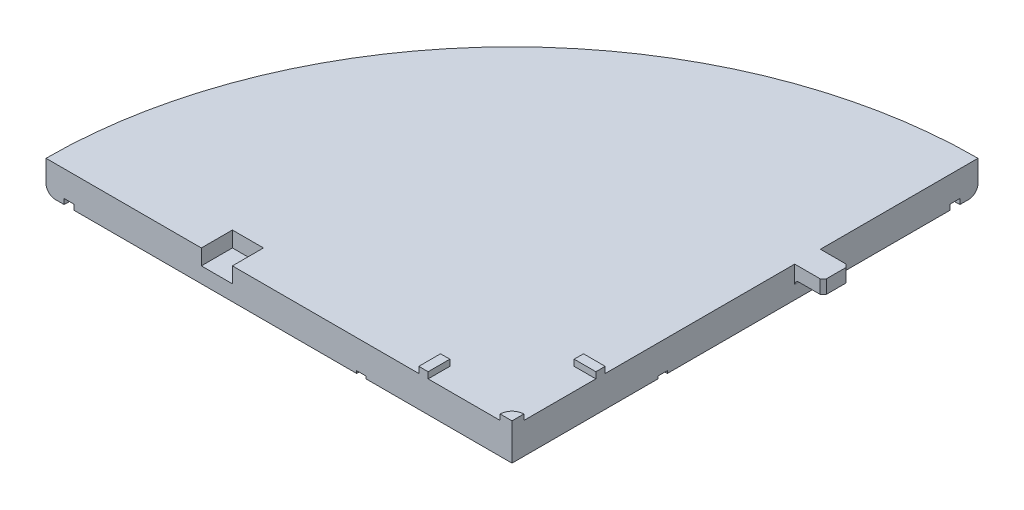
ISO-10303-21;
HEADER;
FILE_DESCRIPTION(('STEP AP214'),'2;1');
FILE_NAME('part.step','',(''),(''),'','','');
FILE_SCHEMA(('AUTOMOTIVE_DESIGN { 1 0 10303 214 1 1 1 1 }'));
ENDSEC;
DATA;
#1=APPLICATION_CONTEXT('core data for automotive mechanical design processes');
#2=APPLICATION_PROTOCOL_DEFINITION('international standard','automotive_design',2000,#1);
#3=PRODUCT_CONTEXT('',#1,'mechanical');
#4=PRODUCT('Part','Part','',(#3));
#5=PRODUCT_RELATED_PRODUCT_CATEGORY('part','',(#4));
#6=PRODUCT_DEFINITION_FORMATION('','',#4);
#7=PRODUCT_DEFINITION_CONTEXT('part definition',#1,'design');
#8=PRODUCT_DEFINITION('design','',#6,#7);
#9=PRODUCT_DEFINITION_SHAPE('','',#8);
#10=(LENGTH_UNIT() NAMED_UNIT(*) SI_UNIT(.MILLI.,.METRE.));
#11=(NAMED_UNIT(*) PLANE_ANGLE_UNIT() SI_UNIT($,.RADIAN.));
#12=(NAMED_UNIT(*) SI_UNIT($,.STERADIAN.) SOLID_ANGLE_UNIT());
#13=UNCERTAINTY_MEASURE_WITH_UNIT(LENGTH_MEASURE(1.E-05),#10,'distance_accuracy_value','');
#14=(GEOMETRIC_REPRESENTATION_CONTEXT(3) GLOBAL_UNCERTAINTY_ASSIGNED_CONTEXT((#13)) GLOBAL_UNIT_ASSIGNED_CONTEXT((#10,
#11,#12)) REPRESENTATION_CONTEXT('',''));
#15=CARTESIAN_POINT('',(0.,0.,0.));
#16=DIRECTION('',(0.,0.,1.));
#17=DIRECTION('',(1.,0.,0.));
#18=AXIS2_PLACEMENT_3D('',#15,#16,#17);
#19=CARTESIAN_POINT('',(0.,0.,0.));
#20=DIRECTION('',(0.,1.,0.));
#21=DIRECTION('',(0.,0.,1.));
#22=AXIS2_PLACEMENT_3D('',#19,#20,#21);
#23=PLANE('',#22);
#24=DIRECTION('',(0.,0.,-1.));
#25=VECTOR('',#24,1.);
#26=CARTESIAN_POINT('',(-47.,0.,0.));
#27=LINE('',#26,#25);
#28=CARTESIAN_POINT('',(-47.,0.,0.));
#29=VERTEX_POINT('',#28);
#30=CARTESIAN_POINT('',(-47.,0.,-47.));
#31=VERTEX_POINT('',#30);
#32=EDGE_CURVE('E534',#29,#31,#27,.T.);
#33=ORIENTED_EDGE('',*,*,#32,.T.);
#34=DIRECTION('',(-1.,0.,0.));
#35=VECTOR('',#34,1.);
#36=CARTESIAN_POINT('',(0.,0.,-47.));
#37=LINE('',#36,#35);
#38=CARTESIAN_POINT('',(0.,0.,-47.));
#39=VERTEX_POINT('',#38);
#40=EDGE_CURVE('E536',#39,#31,#37,.T.);
#41=ORIENTED_EDGE('',*,*,#40,.F.);
#42=DIRECTION('',(0.,0.,1.));
#43=VECTOR('',#42,1.);
#44=CARTESIAN_POINT('',(0.,0.,0.));
#45=LINE('',#44,#43);
#46=CARTESIAN_POINT('',(0.,0.,0.));
#47=VERTEX_POINT('',#46);
#48=EDGE_CURVE('E461',#39,#47,#45,.T.);
#49=ORIENTED_EDGE('',*,*,#48,.T.);
#50=DIRECTION('',(-1.,0.,0.));
#51=VECTOR('',#50,1.);
#52=CARTESIAN_POINT('',(-217.91648215282,0.,0.));
#53=LINE('',#52,#51);
#54=EDGE_CURVE('E439',#47,#29,#53,.T.);
#55=ORIENTED_EDGE('',*,*,#54,.T.);
#56=EDGE_LOOP('',(#33,#41,#49,#55));
#57=FACE_BOUND('',#56,.T.);
#58=ADVANCED_FACE('F36',(#57),#23,.F.);
#59=DIRECTION('',(-1.,0.,0.));
#60=VECTOR('',#59,1.);
#61=CARTESIAN_POINT('',(0.,0.,-50.));
#62=LINE('',#61,#60);
#63=CARTESIAN_POINT('',(0.,0.,-50.));
#64=VERTEX_POINT('',#63);
#65=CARTESIAN_POINT('',(-50.,0.,-50.));
#66=VERTEX_POINT('',#65);
#67=EDGE_CURVE('E543',#64,#66,#62,.T.);
#68=ORIENTED_EDGE('',*,*,#67,.T.);
#69=DIRECTION('',(0.,0.,-1.));
#70=VECTOR('',#69,1.);
#71=CARTESIAN_POINT('',(-50.,0.,0.));
#72=LINE('',#71,#70);
#73=CARTESIAN_POINT('',(-50.,0.,0.));
#74=VERTEX_POINT('',#73);
#75=EDGE_CURVE('E556',#74,#66,#72,.T.);
#76=ORIENTED_EDGE('',*,*,#75,.F.);
#77=CARTESIAN_POINT('',(-140.926536809106,0.,0.));
#78=VERTEX_POINT('',#77);
#79=EDGE_CURVE('E288',#74,#78,#53,.T.);
#80=ORIENTED_EDGE('',*,*,#79,.T.);
#81=CARTESIAN_POINT('',(0.,0.,0.));
#82=DIRECTION('',(0.,1.,0.));
#83=DIRECTION('',(0.,0.,-1.));
#84=AXIS2_PLACEMENT_3D('',#81,#82,#83);
#85=CIRCLE('',#84,140.926536809106);
#86=CARTESIAN_POINT('',(0.,0.,-140.926536809106));
#87=VERTEX_POINT('',#86);
#88=EDGE_CURVE('E310',#87,#78,#85,.T.);
#89=ORIENTED_EDGE('',*,*,#88,.F.);
#90=EDGE_CURVE('E465',#87,#64,#45,.T.);
#91=ORIENTED_EDGE('',*,*,#90,.T.);
#92=EDGE_LOOP('',(#68,#76,#80,#89,#91));
#93=FACE_BOUND('',#92,.T.);
#94=ADVANCED_FACE('F542',(#93),#23,.F.);
#95=CARTESIAN_POINT('',(-217.91648215282,0.,0.));
#96=DIRECTION('',(0.,0.,-1.));
#97=DIRECTION('',(-1.,0.,0.));
#98=AXIS2_PLACEMENT_3D('',#95,#96,#97);
#99=PLANE('',#98);
#100=DIRECTION('',(0.,-1.,0.));
#101=VECTOR('',#100,1.);
#102=CARTESIAN_POINT('',(-150.,10.,0.));
#103=LINE('',#102,#101);
#104=CARTESIAN_POINT('',(-150.,3.,0.));
#105=VERTEX_POINT('',#104);
#106=CARTESIAN_POINT('',(-150.,10.,0.));
#107=VERTEX_POINT('',#106);
#108=EDGE_CURVE('E456',#105,#107,#103,.F.);
#109=ORIENTED_EDGE('',*,*,#108,.F.);
#110=CARTESIAN_POINT('',(-147.,3.,0.));
#111=DIRECTION('',(0.,0.,-1.));
#112=DIRECTION('',(-1.,0.,0.));
#113=AXIS2_PLACEMENT_3D('',#110,#111,#112);
#114=CIRCLE('',#113,3.);
#115=CARTESIAN_POINT('',(-147.,0.,0.));
#116=VERTEX_POINT('',#115);
#117=EDGE_CURVE('E487',#105,#116,#114,.F.);
#118=ORIENTED_EDGE('',*,*,#117,.T.);
#119=CARTESIAN_POINT('',(-144.178447036119,0.,0.));
#120=VERTEX_POINT('',#119);
#121=EDGE_CURVE('E443',#120,#116,#53,.T.);
#122=ORIENTED_EDGE('',*,*,#121,.F.);
#123=DIRECTION('',(0.,-1.,0.));
#124=VECTOR('',#123,1.);
#125=CARTESIAN_POINT('',(-144.178447036119,1.7,0.));
#126=LINE('',#125,#124);
#127=CARTESIAN_POINT('',(-144.178447036119,1.7,0.));
#128=VERTEX_POINT('',#127);
#129=EDGE_CURVE('E322',#128,#120,#126,.T.);
#130=ORIENTED_EDGE('',*,*,#129,.F.);
#131=DIRECTION('',(-1.,0.,0.));
#132=VECTOR('',#131,1.);
#133=CARTESIAN_POINT('',(-140.926536809106,1.7,0.));
#134=LINE('',#133,#132);
#135=CARTESIAN_POINT('',(-140.926536809106,1.7,0.));
#136=VERTEX_POINT('',#135);
#137=EDGE_CURVE('E299',#136,#128,#134,.T.);
#138=ORIENTED_EDGE('',*,*,#137,.F.);
#139=DIRECTION('',(0.,-1.,0.));
#140=VECTOR('',#139,1.);
#141=CARTESIAN_POINT('',(-140.926536809106,1.7,0.));
#142=LINE('',#141,#140);
#143=EDGE_CURVE('E309',#136,#78,#142,.T.);
#144=ORIENTED_EDGE('',*,*,#143,.T.);
#145=ORIENTED_EDGE('',*,*,#79,.F.);
#146=DIRECTION('',(0.,-1.,0.));
#147=VECTOR('',#146,1.);
#148=CARTESIAN_POINT('',(-50.,0.8,0.));
#149=LINE('',#148,#147);
#150=CARTESIAN_POINT('',(-50.,0.8,0.));
#151=VERTEX_POINT('',#150);
#152=EDGE_CURVE('E268',#151,#74,#149,.T.);
#153=ORIENTED_EDGE('',*,*,#152,.F.);
#154=DIRECTION('',(-1.,0.,0.));
#155=VECTOR('',#154,1.);
#156=CARTESIAN_POINT('',(0.,0.8,0.));
#157=LINE('',#156,#155);
#158=CARTESIAN_POINT('',(-47.,0.8,0.));
#159=VERTEX_POINT('',#158);
#160=EDGE_CURVE('E274',#159,#151,#157,.T.);
#161=ORIENTED_EDGE('',*,*,#160,.F.);
#162=DIRECTION('',(0.,-1.,0.));
#163=VECTOR('',#162,1.);
#164=CARTESIAN_POINT('',(-47.,0.8,0.));
#165=LINE('',#164,#163);
#166=EDGE_CURVE('E289',#159,#29,#165,.T.);
#167=ORIENTED_EDGE('',*,*,#166,.T.);
#168=ORIENTED_EDGE('',*,*,#54,.F.);
#169=DIRECTION('',(0.,1.,0.));
#170=VECTOR('',#169,1.);
#171=CARTESIAN_POINT('',(0.,0.,0.));
#172=LINE('',#171,#170);
#173=CARTESIAN_POINT('',(0.,11.8,0.));
#174=VERTEX_POINT('',#173);
#175=EDGE_CURVE('E442',#47,#174,#172,.T.);
#176=ORIENTED_EDGE('',*,*,#175,.T.);
#177=DIRECTION('',(1.,0.,0.));
#178=VECTOR('',#177,1.);
#179=CARTESIAN_POINT('',(0.,11.8,0.));
#180=LINE('',#179,#178);
#181=CARTESIAN_POINT('',(-3.825,11.8,0.));
#182=VERTEX_POINT('',#181);
#183=EDGE_CURVE('E423',#182,#174,#180,.T.);
#184=ORIENTED_EDGE('',*,*,#183,.F.);
#185=DIRECTION('',(0.,-1.,0.));
#186=VECTOR('',#185,1.);
#187=CARTESIAN_POINT('',(-3.825,11.8,0.));
#188=LINE('',#187,#186);
#189=CARTESIAN_POINT('',(-3.825,10.,0.));
#190=VERTEX_POINT('',#189);
#191=EDGE_CURVE('E430',#182,#190,#188,.T.);
#192=ORIENTED_EDGE('',*,*,#191,.T.);
#193=DIRECTION('',(-1.,0.,0.));
#194=VECTOR('',#193,1.);
#195=CARTESIAN_POINT('',(-217.91648215282,10.,0.));
#196=LINE('',#195,#194);
#197=CARTESIAN_POINT('',(-27.,10.,0.));
#198=VERTEX_POINT('',#197);
#199=EDGE_CURVE('E444',#190,#198,#196,.T.);
#200=ORIENTED_EDGE('',*,*,#199,.T.);
#201=DIRECTION('',(0.,-1.,0.));
#202=VECTOR('',#201,1.);
#203=CARTESIAN_POINT('',(-27.,12.,0.));
#204=LINE('',#203,#202);
#205=CARTESIAN_POINT('',(-27.,12.,0.));
#206=VERTEX_POINT('',#205);
#207=EDGE_CURVE('E420',#206,#198,#204,.T.);
#208=ORIENTED_EDGE('',*,*,#207,.F.);
#209=DIRECTION('',(1.,0.,0.));
#210=VECTOR('',#209,1.);
#211=CARTESIAN_POINT('',(-27.,12.,0.));
#212=LINE('',#211,#210);
#213=CARTESIAN_POINT('',(-30.,12.,0.));
#214=VERTEX_POINT('',#213);
#215=EDGE_CURVE('E397',#214,#206,#212,.T.);
#216=ORIENTED_EDGE('',*,*,#215,.F.);
#217=DIRECTION('',(0.,-1.,0.));
#218=VECTOR('',#217,1.);
#219=CARTESIAN_POINT('',(-30.,12.,0.));
#220=LINE('',#219,#218);
#221=CARTESIAN_POINT('',(-30.0000000000001,10.,0.));
#222=VERTEX_POINT('',#221);
#223=EDGE_CURVE('E407',#214,#222,#220,.T.);
#224=ORIENTED_EDGE('',*,*,#223,.T.);
#225=CARTESIAN_POINT('',(-90.0000000000001,10.,0.));
#226=VERTEX_POINT('',#225);
#227=EDGE_CURVE('E448',#222,#226,#196,.T.);
#228=ORIENTED_EDGE('',*,*,#227,.T.);
#229=DIRECTION('',(0.,1.,0.));
#230=VECTOR('',#229,1.);
#231=CARTESIAN_POINT('',(-90.0000000000001,5.,0.));
#232=LINE('',#231,#230);
#233=CARTESIAN_POINT('',(-90.0000000000001,5.,0.));
#234=VERTEX_POINT('',#233);
#235=EDGE_CURVE('E364',#234,#226,#232,.T.);
#236=ORIENTED_EDGE('',*,*,#235,.F.);
#237=DIRECTION('',(1.,0.,0.));
#238=VECTOR('',#237,1.);
#239=CARTESIAN_POINT('',(0.,5.,0.));
#240=LINE('',#239,#238);
#241=CARTESIAN_POINT('',(-100.,5.,0.));
#242=VERTEX_POINT('',#241);
#243=EDGE_CURVE('E349',#242,#234,#240,.T.);
#244=ORIENTED_EDGE('',*,*,#243,.F.);
#245=DIRECTION('',(0.,1.,0.));
#246=VECTOR('',#245,1.);
#247=CARTESIAN_POINT('',(-100.,5.,0.));
#248=LINE('',#247,#246);
#249=CARTESIAN_POINT('',(-100.,10.,0.));
#250=VERTEX_POINT('',#249);
#251=EDGE_CURVE('E366',#242,#250,#248,.T.);
#252=ORIENTED_EDGE('',*,*,#251,.T.);
#253=EDGE_CURVE('E438',#250,#107,#196,.T.);
#254=ORIENTED_EDGE('',*,*,#253,.T.);
#255=EDGE_LOOP('',(#109,#118,#122,#130,#138,#144,#145,#153,#161,#167,#168,#176,#184,#192,#200,
#208,#216,#224,#228,#236,#244,#252,#254));
#256=FACE_BOUND('',#255,.T.);
#257=ADVANCED_FACE('F286',(#256),#99,.F.);
#258=CARTESIAN_POINT('',(0.,0.,0.));
#259=DIRECTION('',(-1.,0.,0.));
#260=DIRECTION('',(0.,0.,1.));
#261=AXIS2_PLACEMENT_3D('',#258,#259,#260);
#262=PLANE('',#261);
#263=DIRECTION('',(0.,1.,0.));
#264=VECTOR('',#263,1.);
#265=CARTESIAN_POINT('',(0.,5.65,-99.2773150453995));
#266=LINE('',#265,#264);
#267=CARTESIAN_POINT('',(0.,4.25,-99.2773150453995));
#268=VERTEX_POINT('',#267);
#269=CARTESIAN_POINT('',(0.,10.,-99.2773150453995));
#270=VERTEX_POINT('',#269);
#271=EDGE_CURVE('E51',#268,#270,#266,.T.);
#272=ORIENTED_EDGE('',*,*,#271,.F.);
#273=DIRECTION('',(0.,0.,-1.));
#274=VECTOR('',#273,1.);
#275=CARTESIAN_POINT('',(0.,4.25,-91.));
#276=LINE('',#275,#274);
#277=CARTESIAN_POINT('',(0.,4.25,-91.));
#278=VERTEX_POINT('',#277);
#279=EDGE_CURVE('E496',#268,#278,#276,.F.);
#280=ORIENTED_EDGE('',*,*,#279,.T.);
#281=DIRECTION('',(0.,1.,0.));
#282=VECTOR('',#281,1.);
#283=CARTESIAN_POINT('',(0.,5.65,-91.));
#284=LINE('',#283,#282);
#285=CARTESIAN_POINT('',(0.,10.,-91.));
#286=VERTEX_POINT('',#285);
#287=EDGE_CURVE('E58',#278,#286,#284,.T.);
#288=ORIENTED_EDGE('',*,*,#287,.T.);
#289=DIRECTION('',(0.,0.,1.));
#290=VECTOR('',#289,1.);
#291=CARTESIAN_POINT('',(0.,10.,0.));
#292=LINE('',#291,#290);
#293=CARTESIAN_POINT('',(0.,10.,-30.));
#294=VERTEX_POINT('',#293);
#295=EDGE_CURVE('E451',#286,#294,#292,.T.);
#296=ORIENTED_EDGE('',*,*,#295,.T.);
#297=DIRECTION('',(0.,-1.,0.));
#298=VECTOR('',#297,1.);
#299=CARTESIAN_POINT('',(0.,12.,-30.));
#300=LINE('',#299,#298);
#301=CARTESIAN_POINT('',(0.,12.,-30.));
#302=VERTEX_POINT('',#301);
#303=EDGE_CURVE('E393',#302,#294,#300,.T.);
#304=ORIENTED_EDGE('',*,*,#303,.F.);
#305=DIRECTION('',(0.,0.,-1.));
#306=VECTOR('',#305,1.);
#307=CARTESIAN_POINT('',(0.,12.,-30.));
#308=LINE('',#307,#306);
#309=CARTESIAN_POINT('',(0.,12.,-27.));
#310=VERTEX_POINT('',#309);
#311=EDGE_CURVE('E370',#310,#302,#308,.T.);
#312=ORIENTED_EDGE('',*,*,#311,.F.);
#313=DIRECTION('',(0.,-1.,0.));
#314=VECTOR('',#313,1.);
#315=CARTESIAN_POINT('',(0.,12.,-27.));
#316=LINE('',#315,#314);
#317=CARTESIAN_POINT('',(0.,10.,-27.));
#318=VERTEX_POINT('',#317);
#319=EDGE_CURVE('E380',#310,#318,#316,.T.);
#320=ORIENTED_EDGE('',*,*,#319,.T.);
#321=CARTESIAN_POINT('',(0.,10.,-3.825));
#322=VERTEX_POINT('',#321);
#323=EDGE_CURVE('E447',#318,#322,#292,.T.);
#324=ORIENTED_EDGE('',*,*,#323,.T.);
#325=DIRECTION('',(0.,-1.,0.));
#326=VECTOR('',#325,1.);
#327=CARTESIAN_POINT('',(0.,11.8,-3.825));
#328=LINE('',#327,#326);
#329=CARTESIAN_POINT('',(0.,11.8,-3.825));
#330=VERTEX_POINT('',#329);
#331=EDGE_CURVE('E435',#330,#322,#328,.T.);
#332=ORIENTED_EDGE('',*,*,#331,.F.);
#333=DIRECTION('',(0.,0.,-1.));
#334=VECTOR('',#333,1.);
#335=CARTESIAN_POINT('',(0.,11.8,-3.825));
#336=LINE('',#335,#334);
#337=EDGE_CURVE('E426',#174,#330,#336,.T.);
#338=ORIENTED_EDGE('',*,*,#337,.F.);
#339=ORIENTED_EDGE('',*,*,#175,.F.);
#340=ORIENTED_EDGE('',*,*,#48,.F.);
#341=DIRECTION('',(0.,-1.,0.));
#342=VECTOR('',#341,1.);
#343=CARTESIAN_POINT('',(0.,0.8,-47.));
#344=LINE('',#343,#342);
#345=CARTESIAN_POINT('',(0.,0.8,-47.));
#346=VERTEX_POINT('',#345);
#347=EDGE_CURVE('E550',#346,#39,#344,.T.);
#348=ORIENTED_EDGE('',*,*,#347,.F.);
#349=DIRECTION('',(0.,0.,1.));
#350=VECTOR('',#349,1.);
#351=CARTESIAN_POINT('',(0.,0.8,0.));
#352=LINE('',#351,#350);
#353=CARTESIAN_POINT('',(0.,0.8,-50.));
#354=VERTEX_POINT('',#353);
#355=EDGE_CURVE('E548',#354,#346,#352,.T.);
#356=ORIENTED_EDGE('',*,*,#355,.F.);
#357=DIRECTION('',(0.,-1.,0.));
#358=VECTOR('',#357,1.);
#359=CARTESIAN_POINT('',(0.,0.8,-50.));
#360=LINE('',#359,#358);
#361=EDGE_CURVE('E291',#354,#64,#360,.T.);
#362=ORIENTED_EDGE('',*,*,#361,.T.);
#363=ORIENTED_EDGE('',*,*,#90,.F.);
#364=DIRECTION('',(0.,-1.,0.));
#365=VECTOR('',#364,1.);
#366=CARTESIAN_POINT('',(0.,1.7,-140.926536809106));
#367=LINE('',#366,#365);
#368=CARTESIAN_POINT('',(0.,1.7,-140.926536809106));
#369=VERTEX_POINT('',#368);
#370=EDGE_CURVE('E316',#369,#87,#367,.T.);
#371=ORIENTED_EDGE('',*,*,#370,.F.);
#372=DIRECTION('',(0.,0.,1.));
#373=VECTOR('',#372,1.);
#374=CARTESIAN_POINT('',(0.,1.7,-140.926536809106));
#375=LINE('',#374,#373);
#376=CARTESIAN_POINT('',(0.,1.7,-144.178447036119));
#377=VERTEX_POINT('',#376);
#378=EDGE_CURVE('E306',#377,#369,#375,.T.);
#379=ORIENTED_EDGE('',*,*,#378,.F.);
#380=DIRECTION('',(0.,-1.,0.));
#381=VECTOR('',#380,1.);
#382=CARTESIAN_POINT('',(0.,1.7,-144.178447036119));
#383=LINE('',#382,#381);
#384=CARTESIAN_POINT('',(0.,0.,-144.178447036119));
#385=VERTEX_POINT('',#384);
#386=EDGE_CURVE('E319',#377,#385,#383,.T.);
#387=ORIENTED_EDGE('',*,*,#386,.T.);
#388=CARTESIAN_POINT('',(0.,0.,-147.));
#389=VERTEX_POINT('',#388);
#390=EDGE_CURVE('E462',#389,#385,#45,.T.);
#391=ORIENTED_EDGE('',*,*,#390,.F.);
#392=CARTESIAN_POINT('',(0.,3.,-147.));
#393=DIRECTION('',(-1.,0.,0.));
#394=DIRECTION('',(0.,0.,1.));
#395=AXIS2_PLACEMENT_3D('',#392,#393,#394);
#396=CIRCLE('',#395,3.);
#397=CARTESIAN_POINT('',(0.,3.,-150.));
#398=VERTEX_POINT('',#397);
#399=EDGE_CURVE('E491',#389,#398,#396,.F.);
#400=ORIENTED_EDGE('',*,*,#399,.T.);
#401=DIRECTION('',(0.,-1.,0.));
#402=VECTOR('',#401,1.);
#403=CARTESIAN_POINT('',(0.,10.,-150.));
#404=LINE('',#403,#402);
#405=CARTESIAN_POINT('',(0.,10.,-150.));
#406=VERTEX_POINT('',#405);
#407=EDGE_CURVE('E453',#406,#398,#404,.T.);
#408=ORIENTED_EDGE('',*,*,#407,.F.);
#409=EDGE_CURVE('E449',#406,#270,#292,.T.);
#410=ORIENTED_EDGE('',*,*,#409,.T.);
#411=EDGE_LOOP('',(#272,#280,#288,#296,#304,#312,#320,#324,#332,#338,#339,#340,#348,#356,#362,
#363,#371,#379,#387,#391,#400,#408,#410));
#412=FACE_BOUND('',#411,.T.);
#413=ADVANCED_FACE('F505',(#412),#262,.F.);
#414=CARTESIAN_POINT('',(0.,10.,0.));
#415=DIRECTION('',(0.,1.,0.));
#416=DIRECTION('',(0.,0.,1.));
#417=AXIS2_PLACEMENT_3D('',#414,#415,#416);
#418=PLANE('',#417);
#419=DIRECTION('',(1.,0.,0.));
#420=VECTOR('',#419,1.);
#421=CARTESIAN_POINT('',(0.,10.,-91.));
#422=LINE('',#421,#420);
#423=CARTESIAN_POINT('',(8.19375165728234,10.,-91.));
#424=VERTEX_POINT('',#423);
#425=EDGE_CURVE('E329',#286,#424,#422,.T.);
#426=ORIENTED_EDGE('',*,*,#425,.T.);
#427=DIRECTION('',(-0.707106781186538,0.,0.707106781186557));
#428=VECTOR('',#427,1.);
#429=CARTESIAN_POINT('',(-41.4031241713587,10.,-41.4031241713576));
#430=LINE('',#429,#428);
#431=CARTESIAN_POINT('',(9.19375165728231,10.,-92.));
#432=VERTEX_POINT('',#431);
#433=EDGE_CURVE('E470',#424,#432,#430,.F.);
#434=ORIENTED_EDGE('',*,*,#433,.T.);
#435=DIRECTION('',(0.,0.,-1.));
#436=VECTOR('',#435,1.);
#437=CARTESIAN_POINT('',(9.19375165728231,10.,0.));
#438=LINE('',#437,#436);
#439=CARTESIAN_POINT('',(9.19375165728231,10.,-98.2773150453994));
#440=VERTEX_POINT('',#439);
#441=EDGE_CURVE('E318',#432,#440,#438,.T.);
#442=ORIENTED_EDGE('',*,*,#441,.T.);
#443=DIRECTION('',(0.707106781186538,0.,0.707106781186557));
#444=VECTOR('',#443,1.);
#445=CARTESIAN_POINT('',(53.735533351341,10.,-53.7355333513395));
#446=LINE('',#445,#444);
#447=CARTESIAN_POINT('',(8.19375165728228,10.,-99.2773150453995));
#448=VERTEX_POINT('',#447);
#449=EDGE_CURVE('E468',#440,#448,#446,.F.);
#450=ORIENTED_EDGE('',*,*,#449,.T.);
#451=DIRECTION('',(-1.,0.,0.));
#452=VECTOR('',#451,1.);
#453=CARTESIAN_POINT('',(0.,10.,-99.2773150453995));
#454=LINE('',#453,#452);
#455=EDGE_CURVE('E336',#448,#270,#454,.T.);
#456=ORIENTED_EDGE('',*,*,#455,.T.);
#457=ORIENTED_EDGE('',*,*,#409,.F.);
#458=CARTESIAN_POINT('',(0.,10.,0.));
#459=DIRECTION('',(0.,1.,0.));
#460=DIRECTION('',(0.,0.,1.));
#461=AXIS2_PLACEMENT_3D('',#458,#459,#460);
#462=CIRCLE('',#461,150.);
#463=EDGE_CURVE('E458',#406,#107,#462,.T.);
#464=ORIENTED_EDGE('',*,*,#463,.T.);
#465=ORIENTED_EDGE('',*,*,#253,.F.);
#466=DIRECTION('',(0.,0.,1.));
#467=VECTOR('',#466,1.);
#468=CARTESIAN_POINT('',(-100.,10.,0.));
#469=LINE('',#468,#467);
#470=CARTESIAN_POINT('',(-100.,10.,-9.99999999999999));
#471=VERTEX_POINT('',#470);
#472=EDGE_CURVE('E357',#471,#250,#469,.T.);
#473=ORIENTED_EDGE('',*,*,#472,.F.);
#474=DIRECTION('',(-1.,0.,0.));
#475=VECTOR('',#474,1.);
#476=CARTESIAN_POINT('',(0.,10.,-10.));
#477=LINE('',#476,#475);
#478=CARTESIAN_POINT('',(-90.0000000000001,10.,-9.99999999999999));
#479=VERTEX_POINT('',#478);
#480=EDGE_CURVE('E341',#479,#471,#477,.T.);
#481=ORIENTED_EDGE('',*,*,#480,.F.);
#482=DIRECTION('',(0.,0.,-1.));
#483=VECTOR('',#482,1.);
#484=CARTESIAN_POINT('',(-90.0000000000001,10.,0.));
#485=LINE('',#484,#483);
#486=EDGE_CURVE('E347',#226,#479,#485,.T.);
#487=ORIENTED_EDGE('',*,*,#486,.F.);
#488=ORIENTED_EDGE('',*,*,#227,.F.);
#489=DIRECTION('',(0.,0.,1.));
#490=VECTOR('',#489,1.);
#491=CARTESIAN_POINT('',(-30.,10.,-7.));
#492=LINE('',#491,#490);
#493=CARTESIAN_POINT('',(-30.,10.,-7.));
#494=VERTEX_POINT('',#493);
#495=EDGE_CURVE('E401',#494,#222,#492,.T.);
#496=ORIENTED_EDGE('',*,*,#495,.F.);
#497=DIRECTION('',(-1.,0.,0.));
#498=VECTOR('',#497,1.);
#499=CARTESIAN_POINT('',(-27.,10.,-7.));
#500=LINE('',#499,#498);
#501=CARTESIAN_POINT('',(-27.,10.,-7.));
#502=VERTEX_POINT('',#501);
#503=EDGE_CURVE('E409',#502,#494,#500,.T.);
#504=ORIENTED_EDGE('',*,*,#503,.F.);
#505=DIRECTION('',(0.,0.,-1.));
#506=VECTOR('',#505,1.);
#507=CARTESIAN_POINT('',(-27.,10.,0.));
#508=LINE('',#507,#506);
#509=EDGE_CURVE('E396',#198,#502,#508,.T.);
#510=ORIENTED_EDGE('',*,*,#509,.F.);
#511=ORIENTED_EDGE('',*,*,#199,.F.);
#512=CARTESIAN_POINT('',(0.,10.,0.));
#513=DIRECTION('',(0.,1.,0.));
#514=DIRECTION('',(0.,0.,1.));
#515=AXIS2_PLACEMENT_3D('',#512,#513,#514);
#516=CIRCLE('',#515,3.825);
#517=EDGE_CURVE('E422',#322,#190,#516,.T.);
#518=ORIENTED_EDGE('',*,*,#517,.F.);
#519=ORIENTED_EDGE('',*,*,#323,.F.);
#520=DIRECTION('',(1.,0.,0.));
#521=VECTOR('',#520,1.);
#522=CARTESIAN_POINT('',(0.,10.,-27.));
#523=LINE('',#522,#521);
#524=CARTESIAN_POINT('',(-7.,10.,-27.));
#525=VERTEX_POINT('',#524);
#526=EDGE_CURVE('E374',#525,#318,#523,.T.);
#527=ORIENTED_EDGE('',*,*,#526,.F.);
#528=DIRECTION('',(0.,0.,1.));
#529=VECTOR('',#528,1.);
#530=CARTESIAN_POINT('',(-7.,10.,-27.));
#531=LINE('',#530,#529);
#532=CARTESIAN_POINT('',(-7.,10.,-30.));
#533=VERTEX_POINT('',#532);
#534=EDGE_CURVE('E382',#533,#525,#531,.T.);
#535=ORIENTED_EDGE('',*,*,#534,.F.);
#536=DIRECTION('',(-1.,0.,0.));
#537=VECTOR('',#536,1.);
#538=CARTESIAN_POINT('',(-7.,10.,-30.));
#539=LINE('',#538,#537);
#540=EDGE_CURVE('E363',#294,#533,#539,.T.);
#541=ORIENTED_EDGE('',*,*,#540,.F.);
#542=ORIENTED_EDGE('',*,*,#295,.F.);
#543=EDGE_LOOP('',(#426,#434,#442,#450,#456,#457,#464,#465,#473,#481,#487,#488,#496,#504,#510,
#511,#518,#519,#527,#535,#541,#542));
#544=FACE_BOUND('',#543,.T.);
#545=ADVANCED_FACE('F510',(#544),#418,.T.);
#546=CARTESIAN_POINT('',(0.,10.,0.));
#547=DIRECTION('',(0.,-1.,0.));
#548=DIRECTION('',(0.,0.,-1.));
#549=AXIS2_PLACEMENT_3D('',#546,#547,#548);
#550=CYLINDRICAL_SURFACE('',#549,150.);
#551=ORIENTED_EDGE('',*,*,#407,.T.);
#552=CARTESIAN_POINT('',(0.,3.,0.));
#553=DIRECTION('',(0.,1.,0.));
#554=DIRECTION('',(0.,0.,1.));
#555=AXIS2_PLACEMENT_3D('',#552,#553,#554);
#556=CIRCLE('',#555,150.);
#557=EDGE_CURVE('E484',#398,#105,#556,.T.);
#558=ORIENTED_EDGE('',*,*,#557,.T.);
#559=ORIENTED_EDGE('',*,*,#108,.T.);
#560=ORIENTED_EDGE('',*,*,#463,.F.);
#561=EDGE_LOOP('',(#551,#558,#559,#560));
#562=FACE_BOUND('',#561,.T.);
#563=ADVANCED_FACE('F591',(#562),#550,.T.);
#564=ORIENTED_EDGE('',*,*,#121,.T.);
#565=CARTESIAN_POINT('',(0.,0.,0.));
#566=DIRECTION('',(0.,1.,0.));
#567=DIRECTION('',(0.,0.,1.));
#568=AXIS2_PLACEMENT_3D('',#565,#566,#567);
#569=CIRCLE('',#568,147.);
#570=EDGE_CURVE('E489',#116,#389,#569,.F.);
#571=ORIENTED_EDGE('',*,*,#570,.T.);
#572=ORIENTED_EDGE('',*,*,#390,.T.);
#573=CARTESIAN_POINT('',(0.,0.,0.));
#574=DIRECTION('',(0.,-1.,0.));
#575=DIRECTION('',(0.,0.,-1.));
#576=AXIS2_PLACEMENT_3D('',#573,#574,#575);
#577=CIRCLE('',#576,144.178447036119);
#578=EDGE_CURVE('E300',#120,#385,#577,.T.);
#579=ORIENTED_EDGE('',*,*,#578,.F.);
#580=EDGE_LOOP('',(#564,#571,#572,#579));
#581=FACE_BOUND('',#580,.T.);
#582=ADVANCED_FACE('F584',(#581),#23,.F.);
#583=CARTESIAN_POINT('',(0.,11.8,0.));
#584=DIRECTION('',(0.,-1.,0.));
#585=DIRECTION('',(0.,0.,-1.));
#586=AXIS2_PLACEMENT_3D('',#583,#584,#585);
#587=CYLINDRICAL_SURFACE('',#586,3.825);
#588=ORIENTED_EDGE('',*,*,#517,.T.);
#589=ORIENTED_EDGE('',*,*,#191,.F.);
#590=CARTESIAN_POINT('',(0.,11.8,0.));
#591=DIRECTION('',(0.,1.,0.));
#592=DIRECTION('',(0.,0.,1.));
#593=AXIS2_PLACEMENT_3D('',#590,#591,#592);
#594=CIRCLE('',#593,3.825);
#595=EDGE_CURVE('E428',#330,#182,#594,.T.);
#596=ORIENTED_EDGE('',*,*,#595,.F.);
#597=ORIENTED_EDGE('',*,*,#331,.T.);
#598=EDGE_LOOP('',(#588,#589,#596,#597));
#599=FACE_BOUND('',#598,.T.);
#600=ADVANCED_FACE('F523',(#599),#587,.T.);
#601=CARTESIAN_POINT('',(0.,11.8,0.));
#602=DIRECTION('',(0.,1.,0.));
#603=DIRECTION('',(0.,0.,1.));
#604=AXIS2_PLACEMENT_3D('',#601,#602,#603);
#605=PLANE('',#604);
#606=ORIENTED_EDGE('',*,*,#183,.T.);
#607=ORIENTED_EDGE('',*,*,#337,.T.);
#608=ORIENTED_EDGE('',*,*,#595,.T.);
#609=EDGE_LOOP('',(#606,#607,#608));
#610=FACE_BOUND('',#609,.T.);
#611=ADVANCED_FACE('F526',(#610),#605,.T.);
#612=CARTESIAN_POINT('',(-27.,12.,0.));
#613=DIRECTION('',(-1.,0.,0.));
#614=DIRECTION('',(0.,0.,1.));
#615=AXIS2_PLACEMENT_3D('',#612,#613,#614);
#616=PLANE('',#615);
#617=ORIENTED_EDGE('',*,*,#509,.T.);
#618=DIRECTION('',(0.,-1.,0.));
#619=VECTOR('',#618,1.);
#620=CARTESIAN_POINT('',(-27.,12.,-7.));
#621=LINE('',#620,#619);
#622=CARTESIAN_POINT('',(-27.,12.,-7.));
#623=VERTEX_POINT('',#622);
#624=EDGE_CURVE('E417',#623,#502,#621,.T.);
#625=ORIENTED_EDGE('',*,*,#624,.F.);
#626=DIRECTION('',(0.,0.,-1.));
#627=VECTOR('',#626,1.);
#628=CARTESIAN_POINT('',(-27.,12.,0.));
#629=LINE('',#628,#627);
#630=EDGE_CURVE('E400',#206,#623,#629,.T.);
#631=ORIENTED_EDGE('',*,*,#630,.F.);
#632=ORIENTED_EDGE('',*,*,#207,.T.);
#633=EDGE_LOOP('',(#617,#625,#631,#632));
#634=FACE_BOUND('',#633,.T.);
#635=ADVANCED_FACE('F900',(#634),#616,.F.);
#636=CARTESIAN_POINT('',(-27.,12.,-7.));
#637=DIRECTION('',(0.,0.,1.));
#638=DIRECTION('',(1.,0.,0.));
#639=AXIS2_PLACEMENT_3D('',#636,#637,#638);
#640=PLANE('',#639);
#641=ORIENTED_EDGE('',*,*,#503,.T.);
#642=DIRECTION('',(0.,-1.,0.));
#643=VECTOR('',#642,1.);
#644=CARTESIAN_POINT('',(-30.,12.,-7.));
#645=LINE('',#644,#643);
#646=CARTESIAN_POINT('',(-30.,12.,-7.));
#647=VERTEX_POINT('',#646);
#648=EDGE_CURVE('E414',#647,#494,#645,.T.);
#649=ORIENTED_EDGE('',*,*,#648,.F.);
#650=DIRECTION('',(-1.,0.,0.));
#651=VECTOR('',#650,1.);
#652=CARTESIAN_POINT('',(-27.,12.,-7.));
#653=LINE('',#652,#651);
#654=EDGE_CURVE('E403',#623,#647,#653,.T.);
#655=ORIENTED_EDGE('',*,*,#654,.F.);
#656=ORIENTED_EDGE('',*,*,#624,.T.);
#657=EDGE_LOOP('',(#641,#649,#655,#656));
#658=FACE_BOUND('',#657,.T.);
#659=ADVANCED_FACE('F890',(#658),#640,.F.);
#660=CARTESIAN_POINT('',(-30.,12.,-7.));
#661=DIRECTION('',(1.,0.,0.));
#662=DIRECTION('',(0.,0.,-1.));
#663=AXIS2_PLACEMENT_3D('',#660,#661,#662);
#664=PLANE('',#663);
#665=ORIENTED_EDGE('',*,*,#495,.T.);
#666=ORIENTED_EDGE('',*,*,#223,.F.);
#667=DIRECTION('',(0.,0.,1.));
#668=VECTOR('',#667,1.);
#669=CARTESIAN_POINT('',(-30.,12.,-7.));
#670=LINE('',#669,#668);
#671=EDGE_CURVE('E405',#647,#214,#670,.T.);
#672=ORIENTED_EDGE('',*,*,#671,.F.);
#673=ORIENTED_EDGE('',*,*,#648,.T.);
#674=EDGE_LOOP('',(#665,#666,#672,#673));
#675=FACE_BOUND('',#674,.T.);
#676=ADVANCED_FACE('F880',(#675),#664,.F.);
#677=CARTESIAN_POINT('',(0.,12.,0.));
#678=DIRECTION('',(0.,1.,0.));
#679=DIRECTION('',(0.,0.,1.));
#680=AXIS2_PLACEMENT_3D('',#677,#678,#679);
#681=PLANE('',#680);
#682=ORIENTED_EDGE('',*,*,#215,.T.);
#683=ORIENTED_EDGE('',*,*,#630,.T.);
#684=ORIENTED_EDGE('',*,*,#654,.T.);
#685=ORIENTED_EDGE('',*,*,#671,.T.);
#686=EDGE_LOOP('',(#682,#683,#684,#685));
#687=FACE_BOUND('',#686,.T.);
#688=ADVANCED_FACE('F871',(#687),#681,.T.);
#689=CARTESIAN_POINT('',(-7.,12.,-30.));
#690=DIRECTION('',(0.,0.,1.));
#691=DIRECTION('',(1.,0.,0.));
#692=AXIS2_PLACEMENT_3D('',#689,#690,#691);
#693=PLANE('',#692);
#694=ORIENTED_EDGE('',*,*,#540,.T.);
#695=DIRECTION('',(0.,-1.,0.));
#696=VECTOR('',#695,1.);
#697=CARTESIAN_POINT('',(-7.,12.,-30.));
#698=LINE('',#697,#696);
#699=CARTESIAN_POINT('',(-7.,12.,-30.));
#700=VERTEX_POINT('',#699);
#701=EDGE_CURVE('E390',#700,#533,#698,.T.);
#702=ORIENTED_EDGE('',*,*,#701,.F.);
#703=DIRECTION('',(-1.,0.,0.));
#704=VECTOR('',#703,1.);
#705=CARTESIAN_POINT('',(-7.,12.,-30.));
#706=LINE('',#705,#704);
#707=EDGE_CURVE('E373',#302,#700,#706,.T.);
#708=ORIENTED_EDGE('',*,*,#707,.F.);
#709=ORIENTED_EDGE('',*,*,#303,.T.);
#710=EDGE_LOOP('',(#694,#702,#708,#709));
#711=FACE_BOUND('',#710,.T.);
#712=ADVANCED_FACE('F862',(#711),#693,.F.);
#713=CARTESIAN_POINT('',(-7.,12.,-27.));
#714=DIRECTION('',(1.,0.,0.));
#715=DIRECTION('',(0.,0.,-1.));
#716=AXIS2_PLACEMENT_3D('',#713,#714,#715);
#717=PLANE('',#716);
#718=ORIENTED_EDGE('',*,*,#534,.T.);
#719=DIRECTION('',(0.,-1.,0.));
#720=VECTOR('',#719,1.);
#721=CARTESIAN_POINT('',(-7.,12.,-27.));
#722=LINE('',#721,#720);
#723=CARTESIAN_POINT('',(-7.,12.,-27.));
#724=VERTEX_POINT('',#723);
#725=EDGE_CURVE('E387',#724,#525,#722,.T.);
#726=ORIENTED_EDGE('',*,*,#725,.F.);
#727=DIRECTION('',(0.,0.,1.));
#728=VECTOR('',#727,1.);
#729=CARTESIAN_POINT('',(-7.,12.,-27.));
#730=LINE('',#729,#728);
#731=EDGE_CURVE('E376',#700,#724,#730,.T.);
#732=ORIENTED_EDGE('',*,*,#731,.F.);
#733=ORIENTED_EDGE('',*,*,#701,.T.);
#734=EDGE_LOOP('',(#718,#726,#732,#733));
#735=FACE_BOUND('',#734,.T.);
#736=ADVANCED_FACE('F852',(#735),#717,.F.);
#737=CARTESIAN_POINT('',(0.,12.,-27.));
#738=DIRECTION('',(0.,0.,-1.));
#739=DIRECTION('',(-1.,0.,0.));
#740=AXIS2_PLACEMENT_3D('',#737,#738,#739);
#741=PLANE('',#740);
#742=ORIENTED_EDGE('',*,*,#526,.T.);
#743=ORIENTED_EDGE('',*,*,#319,.F.);
#744=DIRECTION('',(1.,0.,0.));
#745=VECTOR('',#744,1.);
#746=CARTESIAN_POINT('',(0.,12.,-27.));
#747=LINE('',#746,#745);
#748=EDGE_CURVE('E378',#724,#310,#747,.T.);
#749=ORIENTED_EDGE('',*,*,#748,.F.);
#750=ORIENTED_EDGE('',*,*,#725,.T.);
#751=EDGE_LOOP('',(#742,#743,#749,#750));
#752=FACE_BOUND('',#751,.T.);
#753=ADVANCED_FACE('F842',(#752),#741,.F.);
#754=CARTESIAN_POINT('',(0.,12.,0.));
#755=DIRECTION('',(0.,-1.,0.));
#756=DIRECTION('',(0.,0.,-1.));
#757=AXIS2_PLACEMENT_3D('',#754,#755,#756);
#758=PLANE('',#757);
#759=ORIENTED_EDGE('',*,*,#311,.T.);
#760=ORIENTED_EDGE('',*,*,#707,.T.);
#761=ORIENTED_EDGE('',*,*,#731,.T.);
#762=ORIENTED_EDGE('',*,*,#748,.T.);
#763=EDGE_LOOP('',(#759,#760,#761,#762));
#764=FACE_BOUND('',#763,.T.);
#765=ADVANCED_FACE('F832',(#764),#758,.F.);
#766=CARTESIAN_POINT('',(0.,5.,-10.));
#767=DIRECTION('',(0.,0.,-1.));
#768=DIRECTION('',(-1.,0.,0.));
#769=AXIS2_PLACEMENT_3D('',#766,#767,#768);
#770=PLANE('',#769);
#771=ORIENTED_EDGE('',*,*,#480,.T.);
#772=DIRECTION('',(0.,1.,0.));
#773=VECTOR('',#772,1.);
#774=CARTESIAN_POINT('',(-100.,5.,-9.99999999999999));
#775=LINE('',#774,#773);
#776=CARTESIAN_POINT('',(-100.,5.,-9.99999999999999));
#777=VERTEX_POINT('',#776);
#778=EDGE_CURVE('E354',#777,#471,#775,.T.);
#779=ORIENTED_EDGE('',*,*,#778,.F.);
#780=DIRECTION('',(-1.,0.,0.));
#781=VECTOR('',#780,1.);
#782=CARTESIAN_POINT('',(0.,5.,-10.));
#783=LINE('',#782,#781);
#784=CARTESIAN_POINT('',(-90.0000000000001,5.,-9.99999999999999));
#785=VERTEX_POINT('',#784);
#786=EDGE_CURVE('E343',#785,#777,#783,.T.);
#787=ORIENTED_EDGE('',*,*,#786,.F.);
#788=DIRECTION('',(0.,1.,0.));
#789=VECTOR('',#788,1.);
#790=CARTESIAN_POINT('',(-90.0000000000001,5.,-9.99999999999999));
#791=LINE('',#790,#789);
#792=EDGE_CURVE('E361',#785,#479,#791,.T.);
#793=ORIENTED_EDGE('',*,*,#792,.T.);
#794=EDGE_LOOP('',(#771,#779,#787,#793));
#795=FACE_BOUND('',#794,.T.);
#796=ADVANCED_FACE('F822',(#795),#770,.F.);
#797=CARTESIAN_POINT('',(-90.0000000000001,5.,0.));
#798=DIRECTION('',(1.,0.,0.));
#799=DIRECTION('',(0.,0.,-1.));
#800=AXIS2_PLACEMENT_3D('',#797,#798,#799);
#801=PLANE('',#800);
#802=ORIENTED_EDGE('',*,*,#486,.T.);
#803=ORIENTED_EDGE('',*,*,#792,.F.);
#804=DIRECTION('',(0.,0.,-1.));
#805=VECTOR('',#804,1.);
#806=CARTESIAN_POINT('',(-90.0000000000001,5.,0.));
#807=LINE('',#806,#805);
#808=EDGE_CURVE('E351',#234,#785,#807,.T.);
#809=ORIENTED_EDGE('',*,*,#808,.F.);
#810=ORIENTED_EDGE('',*,*,#235,.T.);
#811=EDGE_LOOP('',(#802,#803,#809,#810));
#812=FACE_BOUND('',#811,.T.);
#813=ADVANCED_FACE('F812',(#812),#801,.F.);
#814=CARTESIAN_POINT('',(-100.,5.,0.));
#815=DIRECTION('',(-1.,0.,0.));
#816=DIRECTION('',(0.,0.,1.));
#817=AXIS2_PLACEMENT_3D('',#814,#815,#816);
#818=PLANE('',#817);
#819=ORIENTED_EDGE('',*,*,#472,.T.);
#820=ORIENTED_EDGE('',*,*,#251,.F.);
#821=DIRECTION('',(0.,0.,1.));
#822=VECTOR('',#821,1.);
#823=CARTESIAN_POINT('',(-100.,5.,0.));
#824=LINE('',#823,#822);
#825=EDGE_CURVE('E346',#777,#242,#824,.T.);
#826=ORIENTED_EDGE('',*,*,#825,.F.);
#827=ORIENTED_EDGE('',*,*,#778,.T.);
#828=EDGE_LOOP('',(#819,#820,#826,#827));
#829=FACE_BOUND('',#828,.T.);
#830=ADVANCED_FACE('F801',(#829),#818,.F.);
#831=CARTESIAN_POINT('',(0.,5.,0.));
#832=DIRECTION('',(0.,1.,0.));
#833=DIRECTION('',(0.,0.,1.));
#834=AXIS2_PLACEMENT_3D('',#831,#832,#833);
#835=PLANE('',#834);
#836=ORIENTED_EDGE('',*,*,#786,.T.);
#837=ORIENTED_EDGE('',*,*,#825,.T.);
#838=ORIENTED_EDGE('',*,*,#243,.T.);
#839=ORIENTED_EDGE('',*,*,#808,.T.);
#840=EDGE_LOOP('',(#836,#837,#838,#839));
#841=FACE_BOUND('',#840,.T.);
#842=ADVANCED_FACE('F620',(#841),#835,.T.);
#843=CARTESIAN_POINT('',(9.19375165728231,5.65,0.));
#844=DIRECTION('',(1.,0.,0.));
#845=DIRECTION('',(0.,0.,-1.));
#846=AXIS2_PLACEMENT_3D('',#843,#844,#845);
#847=PLANE('',#846);
#848=ORIENTED_EDGE('',*,*,#441,.F.);
#849=DIRECTION('',(0.,-1.,0.));
#850=VECTOR('',#849,1.);
#851=CARTESIAN_POINT('',(9.19375165728231,5.65,-92.));
#852=LINE('',#851,#850);
#853=CARTESIAN_POINT('',(9.19375165728231,5.65,-92.));
#854=VERTEX_POINT('',#853);
#855=EDGE_CURVE('E475',#432,#854,#852,.T.);
#856=ORIENTED_EDGE('',*,*,#855,.T.);
#857=DIRECTION('',(0.,0.,-1.));
#858=VECTOR('',#857,1.);
#859=CARTESIAN_POINT('',(9.19375165728231,5.65,0.));
#860=LINE('',#859,#858);
#861=CARTESIAN_POINT('',(9.19375165728231,5.65,-98.2773150453994));
#862=VERTEX_POINT('',#861);
#863=EDGE_CURVE('E325',#854,#862,#860,.T.);
#864=ORIENTED_EDGE('',*,*,#863,.T.);
#865=DIRECTION('',(0.,1.,0.));
#866=VECTOR('',#865,1.);
#867=CARTESIAN_POINT('',(9.19375165728231,5.65,-98.2773150453994));
#868=LINE('',#867,#866);
#869=EDGE_CURVE('E472',#862,#440,#868,.T.);
#870=ORIENTED_EDGE('',*,*,#869,.T.);
#871=EDGE_LOOP('',(#848,#856,#864,#870));
#872=FACE_BOUND('',#871,.T.);
#873=ADVANCED_FACE('F607',(#872),#847,.T.);
#874=CARTESIAN_POINT('',(0.,5.65,-91.));
#875=DIRECTION('',(0.,0.,1.));
#876=DIRECTION('',(1.,0.,0.));
#877=AXIS2_PLACEMENT_3D('',#874,#875,#876);
#878=PLANE('',#877);
#879=ORIENTED_EDGE('',*,*,#287,.F.);
#880=CARTESIAN_POINT('',(1.4,4.25,-91.));
#881=DIRECTION('',(0.,0.,1.));
#882=DIRECTION('',(1.,0.,0.));
#883=AXIS2_PLACEMENT_3D('',#880,#881,#882);
#884=CIRCLE('',#883,1.4);
#885=CARTESIAN_POINT('',(1.4,5.65,-91.));
#886=VERTEX_POINT('',#885);
#887=EDGE_CURVE('E11',#278,#886,#884,.F.);
#888=ORIENTED_EDGE('',*,*,#887,.T.);
#889=DIRECTION('',(1.,0.,0.));
#890=VECTOR('',#889,1.);
#891=CARTESIAN_POINT('',(0.,5.65,-91.));
#892=LINE('',#891,#890);
#893=CARTESIAN_POINT('',(8.19375165728234,5.65,-91.));
#894=VERTEX_POINT('',#893);
#895=EDGE_CURVE('E332',#886,#894,#892,.T.);
#896=ORIENTED_EDGE('',*,*,#895,.T.);
#897=DIRECTION('',(0.,1.,0.));
#898=VECTOR('',#897,1.);
#899=CARTESIAN_POINT('',(8.19375165728234,5.65,-91.));
#900=LINE('',#899,#898);
#901=EDGE_CURVE('E464',#894,#424,#900,.T.);
#902=ORIENTED_EDGE('',*,*,#901,.T.);
#903=ORIENTED_EDGE('',*,*,#425,.F.);
#904=EDGE_LOOP('',(#879,#888,#896,#902,#903));
#905=FACE_BOUND('',#904,.T.);
#906=ADVANCED_FACE('F612',(#905),#878,.T.);
#907=CARTESIAN_POINT('',(0.,5.65,-99.2773150453995));
#908=DIRECTION('',(0.,0.,-1.));
#909=DIRECTION('',(-1.,0.,0.));
#910=AXIS2_PLACEMENT_3D('',#907,#908,#909);
#911=PLANE('',#910);
#912=ORIENTED_EDGE('',*,*,#455,.F.);
#913=DIRECTION('',(0.,-1.,0.));
#914=VECTOR('',#913,1.);
#915=CARTESIAN_POINT('',(8.19375165728228,5.65,-99.2773150453995));
#916=LINE('',#915,#914);
#917=CARTESIAN_POINT('',(8.19375165728228,5.65,-99.2773150453995));
#918=VERTEX_POINT('',#917);
#919=EDGE_CURVE('E482',#448,#918,#916,.T.);
#920=ORIENTED_EDGE('',*,*,#919,.T.);
#921=DIRECTION('',(-1.,0.,0.));
#922=VECTOR('',#921,1.);
#923=CARTESIAN_POINT('',(0.,5.65,-99.2773150453995));
#924=LINE('',#923,#922);
#925=CARTESIAN_POINT('',(1.4,5.65,-99.2773150453995));
#926=VERTEX_POINT('',#925);
#927=EDGE_CURVE('E328',#918,#926,#924,.T.);
#928=ORIENTED_EDGE('',*,*,#927,.T.);
#929=CARTESIAN_POINT('',(1.4,4.25,-99.2773150453995));
#930=DIRECTION('',(0.,0.,-1.));
#931=DIRECTION('',(-1.,0.,0.));
#932=AXIS2_PLACEMENT_3D('',#929,#930,#931);
#933=CIRCLE('',#932,1.4);
#934=EDGE_CURVE('E44',#926,#268,#933,.F.);
#935=ORIENTED_EDGE('',*,*,#934,.T.);
#936=ORIENTED_EDGE('',*,*,#271,.T.);
#937=EDGE_LOOP('',(#912,#920,#928,#935,#936));
#938=FACE_BOUND('',#937,.T.);
#939=ADVANCED_FACE('F500',(#938),#911,.T.);
#940=CARTESIAN_POINT('',(0.,5.65,0.));
#941=DIRECTION('',(0.,1.,0.));
#942=DIRECTION('',(0.,0.,1.));
#943=AXIS2_PLACEMENT_3D('',#940,#941,#942);
#944=PLANE('',#943);
#945=ORIENTED_EDGE('',*,*,#895,.F.);
#946=DIRECTION('',(0.,0.,-1.));
#947=VECTOR('',#946,1.);
#948=CARTESIAN_POINT('',(1.4,5.65,-99.2773150453995));
#949=LINE('',#948,#947);
#950=EDGE_CURVE('E493',#886,#926,#949,.T.);
#951=ORIENTED_EDGE('',*,*,#950,.T.);
#952=ORIENTED_EDGE('',*,*,#927,.F.);
#953=DIRECTION('',(-0.707106781186538,0.,-0.707106781186557));
#954=VECTOR('',#953,1.);
#955=CARTESIAN_POINT('',(9.19375165728231,5.65,-98.2773150453994));
#956=LINE('',#955,#954);
#957=EDGE_CURVE('E477',#918,#862,#956,.F.);
#958=ORIENTED_EDGE('',*,*,#957,.T.);
#959=ORIENTED_EDGE('',*,*,#863,.F.);
#960=DIRECTION('',(0.707106781186538,0.,-0.707106781186557));
#961=VECTOR('',#960,1.);
#962=CARTESIAN_POINT('',(8.19375165728234,5.65,-91.));
#963=LINE('',#962,#961);
#964=EDGE_CURVE('E479',#854,#894,#963,.F.);
#965=ORIENTED_EDGE('',*,*,#964,.T.);
#966=EDGE_LOOP('',(#945,#951,#952,#958,#959,#965));
#967=FACE_BOUND('',#966,.T.);
#968=ADVANCED_FACE('F603',(#967),#944,.F.);
#969=CARTESIAN_POINT('',(8.19375165728234,5.65,-91.));
#970=DIRECTION('',(-0.707106781186557,0.,-0.707106781186538));
#971=DIRECTION('',(0.,1.,0.));
#972=AXIS2_PLACEMENT_3D('',#969,#970,#971);
#973=PLANE('',#972);
#974=ORIENTED_EDGE('',*,*,#964,.F.);
#975=ORIENTED_EDGE('',*,*,#855,.F.);
#976=ORIENTED_EDGE('',*,*,#433,.F.);
#977=ORIENTED_EDGE('',*,*,#901,.F.);
#978=EDGE_LOOP('',(#974,#975,#976,#977));
#979=FACE_BOUND('',#978,.T.);
#980=ADVANCED_FACE('F610',(#979),#973,.F.);
#981=CARTESIAN_POINT('',(9.19375165728231,5.65,-98.2773150453994));
#982=DIRECTION('',(-0.707106781186557,0.,0.707106781186538));
#983=DIRECTION('',(0.,1.,0.));
#984=AXIS2_PLACEMENT_3D('',#981,#982,#983);
#985=PLANE('',#984);
#986=ORIENTED_EDGE('',*,*,#957,.F.);
#987=ORIENTED_EDGE('',*,*,#919,.F.);
#988=ORIENTED_EDGE('',*,*,#449,.F.);
#989=ORIENTED_EDGE('',*,*,#869,.F.);
#990=EDGE_LOOP('',(#986,#987,#988,#989));
#991=FACE_BOUND('',#990,.T.);
#992=ADVANCED_FACE('F598',(#991),#985,.F.);
#993=CARTESIAN_POINT('',(0.,1.7,0.));
#994=DIRECTION('',(0.,-1.,0.));
#995=DIRECTION('',(0.,0.,-1.));
#996=AXIS2_PLACEMENT_3D('',#993,#994,#995);
#997=CYLINDRICAL_SURFACE('',#996,140.926536809106);
#998=ORIENTED_EDGE('',*,*,#88,.T.);
#999=ORIENTED_EDGE('',*,*,#143,.F.);
#1000=CARTESIAN_POINT('',(0.,1.7,0.));
#1001=DIRECTION('',(0.,1.,0.));
#1002=DIRECTION('',(0.,0.,-1.));
#1003=AXIS2_PLACEMENT_3D('',#1000,#1001,#1002);
#1004=CIRCLE('',#1003,140.926536809106);
#1005=EDGE_CURVE('E297',#369,#136,#1004,.T.);
#1006=ORIENTED_EDGE('',*,*,#1005,.F.);
#1007=ORIENTED_EDGE('',*,*,#370,.T.);
#1008=EDGE_LOOP('',(#998,#999,#1006,#1007));
#1009=FACE_BOUND('',#1008,.T.);
#1010=ADVANCED_FACE('F571',(#1009),#997,.T.);
#1011=CARTESIAN_POINT('',(0.,1.7,0.));
#1012=DIRECTION('',(0.,-1.,0.));
#1013=DIRECTION('',(0.,0.,-1.));
#1014=AXIS2_PLACEMENT_3D('',#1011,#1012,#1013);
#1015=CYLINDRICAL_SURFACE('',#1014,144.178447036119);
#1016=ORIENTED_EDGE('',*,*,#578,.T.);
#1017=ORIENTED_EDGE('',*,*,#386,.F.);
#1018=CARTESIAN_POINT('',(0.,1.7,0.));
#1019=DIRECTION('',(0.,-1.,0.));
#1020=DIRECTION('',(0.,0.,-1.));
#1021=AXIS2_PLACEMENT_3D('',#1018,#1019,#1020);
#1022=CIRCLE('',#1021,144.178447036119);
#1023=EDGE_CURVE('E303',#128,#377,#1022,.T.);
#1024=ORIENTED_EDGE('',*,*,#1023,.F.);
#1025=ORIENTED_EDGE('',*,*,#129,.T.);
#1026=EDGE_LOOP('',(#1016,#1017,#1024,#1025));
#1027=FACE_BOUND('',#1026,.T.);
#1028=ADVANCED_FACE('F580',(#1027),#1015,.F.);
#1029=CARTESIAN_POINT('',(0.,1.7,0.));
#1030=DIRECTION('',(0.,-1.,0.));
#1031=DIRECTION('',(0.,0.,-1.));
#1032=AXIS2_PLACEMENT_3D('',#1029,#1030,#1031);
#1033=PLANE('',#1032);
#1034=ORIENTED_EDGE('',*,*,#1005,.T.);
#1035=ORIENTED_EDGE('',*,*,#137,.T.);
#1036=ORIENTED_EDGE('',*,*,#1023,.T.);
#1037=ORIENTED_EDGE('',*,*,#378,.T.);
#1038=EDGE_LOOP('',(#1034,#1035,#1036,#1037));
#1039=FACE_BOUND('',#1038,.T.);
#1040=ADVANCED_FACE('F576',(#1039),#1033,.T.);
#1041=CARTESIAN_POINT('',(-47.,0.8,0.));
#1042=DIRECTION('',(-1.,0.,0.));
#1043=DIRECTION('',(0.,0.,1.));
#1044=AXIS2_PLACEMENT_3D('',#1041,#1042,#1043);
#1045=PLANE('',#1044);
#1046=ORIENTED_EDGE('',*,*,#32,.F.);
#1047=ORIENTED_EDGE('',*,*,#166,.F.);
#1048=DIRECTION('',(0.,0.,-1.));
#1049=VECTOR('',#1048,1.);
#1050=CARTESIAN_POINT('',(-47.,0.8,0.));
#1051=LINE('',#1050,#1049);
#1052=CARTESIAN_POINT('',(-47.,0.8,-47.));
#1053=VERTEX_POINT('',#1052);
#1054=EDGE_CURVE('E279',#159,#1053,#1051,.T.);
#1055=ORIENTED_EDGE('',*,*,#1054,.T.);
#1056=DIRECTION('',(0.,-1.,0.));
#1057=VECTOR('',#1056,1.);
#1058=CARTESIAN_POINT('',(-47.,0.8,-47.));
#1059=LINE('',#1058,#1057);
#1060=EDGE_CURVE('E313',#1053,#31,#1059,.T.);
#1061=ORIENTED_EDGE('',*,*,#1060,.T.);
#1062=EDGE_LOOP('',(#1046,#1047,#1055,#1061));
#1063=FACE_BOUND('',#1062,.T.);
#1064=ADVANCED_FACE('F564',(#1063),#1045,.T.);
#1065=CARTESIAN_POINT('',(0.,0.8,-47.));
#1066=DIRECTION('',(0.,0.,1.));
#1067=DIRECTION('',(1.,0.,0.));
#1068=AXIS2_PLACEMENT_3D('',#1065,#1066,#1067);
#1069=PLANE('',#1068);
#1070=ORIENTED_EDGE('',*,*,#40,.T.);
#1071=ORIENTED_EDGE('',*,*,#1060,.F.);
#1072=DIRECTION('',(-1.,0.,0.));
#1073=VECTOR('',#1072,1.);
#1074=CARTESIAN_POINT('',(0.,0.8,-47.));
#1075=LINE('',#1074,#1073);
#1076=EDGE_CURVE('E293',#346,#1053,#1075,.T.);
#1077=ORIENTED_EDGE('',*,*,#1076,.F.);
#1078=ORIENTED_EDGE('',*,*,#347,.T.);
#1079=EDGE_LOOP('',(#1070,#1071,#1077,#1078));
#1080=FACE_BOUND('',#1079,.T.);
#1081=ADVANCED_FACE('F567',(#1080),#1069,.F.);
#1082=CARTESIAN_POINT('',(0.,0.8,-50.));
#1083=DIRECTION('',(0.,0.,1.));
#1084=DIRECTION('',(1.,0.,0.));
#1085=AXIS2_PLACEMENT_3D('',#1082,#1083,#1084);
#1086=PLANE('',#1085);
#1087=ORIENTED_EDGE('',*,*,#67,.F.);
#1088=ORIENTED_EDGE('',*,*,#361,.F.);
#1089=DIRECTION('',(-1.,0.,0.));
#1090=VECTOR('',#1089,1.);
#1091=CARTESIAN_POINT('',(0.,0.8,-50.));
#1092=LINE('',#1091,#1090);
#1093=CARTESIAN_POINT('',(-50.,0.8,-50.));
#1094=VERTEX_POINT('',#1093);
#1095=EDGE_CURVE('E273',#354,#1094,#1092,.T.);
#1096=ORIENTED_EDGE('',*,*,#1095,.T.);
#1097=DIRECTION('',(0.,-1.,0.));
#1098=VECTOR('',#1097,1.);
#1099=CARTESIAN_POINT('',(-50.,0.8,-50.));
#1100=LINE('',#1099,#1098);
#1101=EDGE_CURVE('E270',#1094,#66,#1100,.T.);
#1102=ORIENTED_EDGE('',*,*,#1101,.T.);
#1103=EDGE_LOOP('',(#1087,#1088,#1096,#1102));
#1104=FACE_BOUND('',#1103,.T.);
#1105=ADVANCED_FACE('F568',(#1104),#1086,.T.);
#1106=CARTESIAN_POINT('',(-50.,0.8,0.));
#1107=DIRECTION('',(-1.,0.,0.));
#1108=DIRECTION('',(0.,0.,1.));
#1109=AXIS2_PLACEMENT_3D('',#1106,#1107,#1108);
#1110=PLANE('',#1109);
#1111=ORIENTED_EDGE('',*,*,#75,.T.);
#1112=ORIENTED_EDGE('',*,*,#1101,.F.);
#1113=DIRECTION('',(0.,0.,-1.));
#1114=VECTOR('',#1113,1.);
#1115=CARTESIAN_POINT('',(-50.,0.8,0.));
#1116=LINE('',#1115,#1114);
#1117=EDGE_CURVE('E263',#151,#1094,#1116,.T.);
#1118=ORIENTED_EDGE('',*,*,#1117,.F.);
#1119=ORIENTED_EDGE('',*,*,#152,.T.);
#1120=EDGE_LOOP('',(#1111,#1112,#1118,#1119));
#1121=FACE_BOUND('',#1120,.T.);
#1122=ADVANCED_FACE('F266',(#1121),#1110,.F.);
#1123=CARTESIAN_POINT('',(0.,0.8,0.));
#1124=DIRECTION('',(0.,-1.,0.));
#1125=DIRECTION('',(0.,0.,-1.));
#1126=AXIS2_PLACEMENT_3D('',#1123,#1124,#1125);
#1127=PLANE('',#1126);
#1128=ORIENTED_EDGE('',*,*,#1054,.F.);
#1129=ORIENTED_EDGE('',*,*,#160,.T.);
#1130=ORIENTED_EDGE('',*,*,#1117,.T.);
#1131=ORIENTED_EDGE('',*,*,#1095,.F.);
#1132=ORIENTED_EDGE('',*,*,#355,.T.);
#1133=ORIENTED_EDGE('',*,*,#1076,.T.);
#1134=EDGE_LOOP('',(#1128,#1129,#1130,#1131,#1132,#1133));
#1135=FACE_BOUND('',#1134,.T.);
#1136=ADVANCED_FACE('F277',(#1135),#1127,.T.);
#1137=CARTESIAN_POINT('',(0.,3.,0.));
#1138=DIRECTION('',(0.,1.,0.));
#1139=DIRECTION('',(0.,0.,1.));
#1140=AXIS2_PLACEMENT_3D('',#1137,#1138,#1139);
#1141=TOROIDAL_SURFACE('',#1140,147.,3.);
#1142=ORIENTED_EDGE('',*,*,#399,.F.);
#1143=ORIENTED_EDGE('',*,*,#570,.F.);
#1144=ORIENTED_EDGE('',*,*,#117,.F.);
#1145=ORIENTED_EDGE('',*,*,#557,.F.);
#1146=EDGE_LOOP('',(#1142,#1143,#1144,#1145));
#1147=FACE_BOUND('',#1146,.T.);
#1148=ADVANCED_FACE('F589',(#1147),#1141,.T.);
#1149=CARTESIAN_POINT('',(1.4,4.25,0.));
#1150=DIRECTION('',(0.,0.,1.));
#1151=DIRECTION('',(1.,0.,0.));
#1152=AXIS2_PLACEMENT_3D('',#1149,#1150,#1151);
#1153=CYLINDRICAL_SURFACE('',#1152,1.4);
#1154=ORIENTED_EDGE('',*,*,#887,.F.);
#1155=ORIENTED_EDGE('',*,*,#279,.F.);
#1156=ORIENTED_EDGE('',*,*,#934,.F.);
#1157=ORIENTED_EDGE('',*,*,#950,.F.);
#1158=EDGE_LOOP('',(#1154,#1155,#1156,#1157));
#1159=FACE_BOUND('',#1158,.T.);
#1160=ADVANCED_FACE('F38',(#1159),#1153,.F.);
#1161=CLOSED_SHELL('',(#58,#94,#257,#413,#545,#563,#582,#600,#611,#635,#659,#676,#688,#712,#736,
#753,#765,#796,#813,#830,#842,#873,#906,#939,#968,#980,#992,#1010,#1028,#1040,#1064,#1081,#1105,
#1122,#1136,#1148,#1160));
#1162=MANIFOLD_SOLID_BREP('B2',#1161);
#1163=ADVANCED_BREP_SHAPE_REPRESENTATION('',(#18,#1162),#14);
#1164=SHAPE_DEFINITION_REPRESENTATION(#9,#1163);
ENDSEC;
END-ISO-10303-21;
